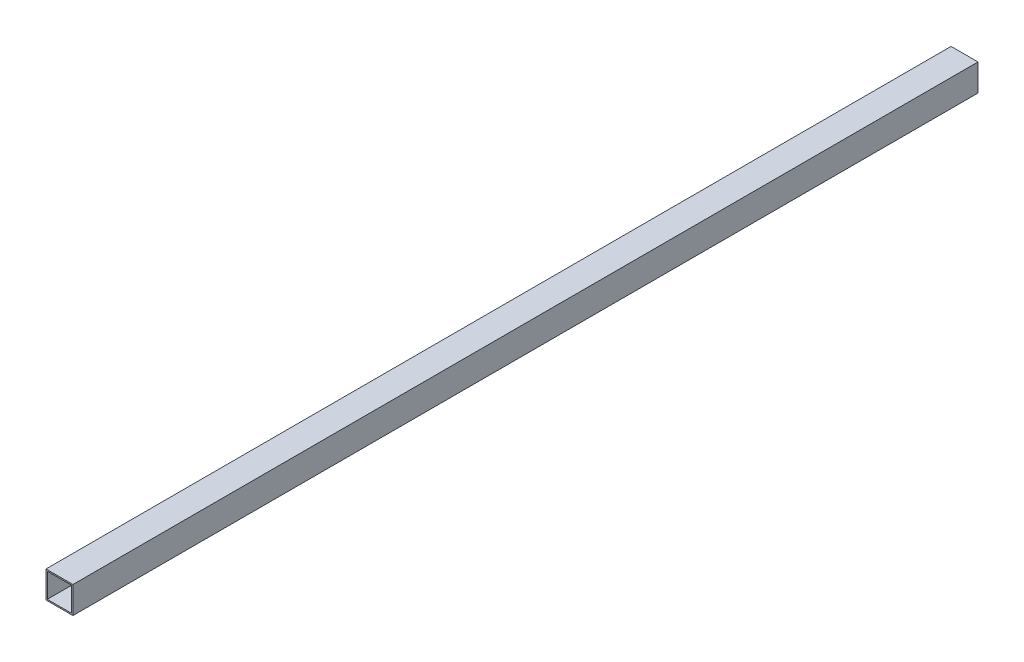
ISO-10303-21;
HEADER;
FILE_DESCRIPTION(('STEP AP214'),'2;1');
FILE_NAME('part.step','',(''),(''),'','','');
FILE_SCHEMA(('AUTOMOTIVE_DESIGN { 1 0 10303 214 1 1 1 1 }'));
ENDSEC;
DATA;
#1=APPLICATION_CONTEXT('core data for automotive mechanical design processes');
#2=APPLICATION_PROTOCOL_DEFINITION('international standard','automotive_design',2000,#1);
#3=PRODUCT_CONTEXT('',#1,'mechanical');
#4=PRODUCT('Part','Part','',(#3));
#5=PRODUCT_RELATED_PRODUCT_CATEGORY('part','',(#4));
#6=PRODUCT_DEFINITION_FORMATION('','',#4);
#7=PRODUCT_DEFINITION_CONTEXT('part definition',#1,'design');
#8=PRODUCT_DEFINITION('design','',#6,#7);
#9=PRODUCT_DEFINITION_SHAPE('','',#8);
#10=(LENGTH_UNIT() NAMED_UNIT(*) SI_UNIT(.MILLI.,.METRE.));
#11=(NAMED_UNIT(*) PLANE_ANGLE_UNIT() SI_UNIT($,.RADIAN.));
#12=(NAMED_UNIT(*) SI_UNIT($,.STERADIAN.) SOLID_ANGLE_UNIT());
#13=UNCERTAINTY_MEASURE_WITH_UNIT(LENGTH_MEASURE(1.E-05),#10,'distance_accuracy_value','');
#14=(GEOMETRIC_REPRESENTATION_CONTEXT(3) GLOBAL_UNCERTAINTY_ASSIGNED_CONTEXT((#13)) GLOBAL_UNIT_ASSIGNED_CONTEXT((#10,
#11,#12)) REPRESENTATION_CONTEXT('',''));
#15=CARTESIAN_POINT('',(0.,0.,0.));
#16=DIRECTION('',(0.,0.,1.));
#17=DIRECTION('',(1.,0.,0.));
#18=AXIS2_PLACEMENT_3D('',#15,#16,#17);
#19=CARTESIAN_POINT('',(0.,0.,840.));
#20=DIRECTION('',(0.,0.,1.));
#21=DIRECTION('',(1.,0.,0.));
#22=AXIS2_PLACEMENT_3D('',#19,#20,#21);
#23=PLANE('',#22);
#24=DIRECTION('',(0.,-1.,0.));
#25=VECTOR('',#24,1.);
#26=CARTESIAN_POINT('',(-12.5,-12.5,840.));
#27=LINE('',#26,#25);
#28=CARTESIAN_POINT('',(-12.5,12.5,840.));
#29=VERTEX_POINT('',#28);
#30=CARTESIAN_POINT('',(-12.5,-12.5,840.));
#31=VERTEX_POINT('',#30);
#32=EDGE_CURVE('E134',#29,#31,#27,.T.);
#33=ORIENTED_EDGE('',*,*,#32,.T.);
#34=DIRECTION('',(1.,0.,0.));
#35=VECTOR('',#34,1.);
#36=CARTESIAN_POINT('',(12.5,-12.5,840.));
#37=LINE('',#36,#35);
#38=CARTESIAN_POINT('',(12.5,-12.5,840.));
#39=VERTEX_POINT('',#38);
#40=EDGE_CURVE('E137',#31,#39,#37,.T.);
#41=ORIENTED_EDGE('',*,*,#40,.T.);
#42=DIRECTION('',(0.,1.,0.));
#43=VECTOR('',#42,1.);
#44=CARTESIAN_POINT('',(12.5,-12.5,840.));
#45=LINE('',#44,#43);
#46=CARTESIAN_POINT('',(12.5,12.5,840.));
#47=VERTEX_POINT('',#46);
#48=EDGE_CURVE('E140',#39,#47,#45,.T.);
#49=ORIENTED_EDGE('',*,*,#48,.T.);
#50=DIRECTION('',(-1.,0.,0.));
#51=VECTOR('',#50,1.);
#52=CARTESIAN_POINT('',(12.5,12.5,840.));
#53=LINE('',#52,#51);
#54=EDGE_CURVE('E142',#47,#29,#53,.T.);
#55=ORIENTED_EDGE('',*,*,#54,.T.);
#56=EDGE_LOOP('',(#33,#41,#49,#55));
#57=FACE_BOUND('',#56,.T.);
#58=DIRECTION('',(-1.,0.,0.));
#59=VECTOR('',#58,1.);
#60=CARTESIAN_POINT('',(11.3,11.3,840.));
#61=LINE('',#60,#59);
#62=CARTESIAN_POINT('',(11.3,11.3,840.));
#63=VERTEX_POINT('',#62);
#64=CARTESIAN_POINT('',(-11.3,11.3,840.));
#65=VERTEX_POINT('',#64);
#66=EDGE_CURVE('E106',#63,#65,#61,.T.);
#67=ORIENTED_EDGE('',*,*,#66,.F.);
#68=DIRECTION('',(0.,1.,0.));
#69=VECTOR('',#68,1.);
#70=CARTESIAN_POINT('',(11.3,-11.3,840.));
#71=LINE('',#70,#69);
#72=CARTESIAN_POINT('',(11.3,-11.3,840.));
#73=VERTEX_POINT('',#72);
#74=EDGE_CURVE('E98',#73,#63,#71,.T.);
#75=ORIENTED_EDGE('',*,*,#74,.F.);
#76=DIRECTION('',(1.,0.,0.));
#77=VECTOR('',#76,1.);
#78=CARTESIAN_POINT('',(11.3,-11.3,840.));
#79=LINE('',#78,#77);
#80=CARTESIAN_POINT('',(-11.3,-11.3,840.));
#81=VERTEX_POINT('',#80);
#82=EDGE_CURVE('E120',#81,#73,#79,.T.);
#83=ORIENTED_EDGE('',*,*,#82,.F.);
#84=DIRECTION('',(0.,-1.,0.));
#85=VECTOR('',#84,1.);
#86=CARTESIAN_POINT('',(-11.3,-11.3,840.));
#87=LINE('',#86,#85);
#88=EDGE_CURVE('E118',#65,#81,#87,.T.);
#89=ORIENTED_EDGE('',*,*,#88,.F.);
#90=EDGE_LOOP('',(#67,#75,#83,#89));
#91=FACE_BOUND('',#90,.T.);
#92=ADVANCED_FACE('F33',(#57,#91),#23,.T.);
#93=CARTESIAN_POINT('',(0.,0.,0.));
#94=DIRECTION('',(0.,0.,1.));
#95=DIRECTION('',(1.,0.,0.));
#96=AXIS2_PLACEMENT_3D('',#93,#94,#95);
#97=PLANE('',#96);
#98=DIRECTION('',(0.,-1.,0.));
#99=VECTOR('',#98,1.);
#100=CARTESIAN_POINT('',(-12.5,-12.5,0.));
#101=LINE('',#100,#99);
#102=CARTESIAN_POINT('',(-12.5,12.5,0.));
#103=VERTEX_POINT('',#102);
#104=CARTESIAN_POINT('',(-12.5,-12.5,0.));
#105=VERTEX_POINT('',#104);
#106=EDGE_CURVE('E114',#103,#105,#101,.T.);
#107=ORIENTED_EDGE('',*,*,#106,.F.);
#108=DIRECTION('',(-1.,0.,0.));
#109=VECTOR('',#108,1.);
#110=CARTESIAN_POINT('',(12.5,12.5,0.));
#111=LINE('',#110,#109);
#112=CARTESIAN_POINT('',(12.5,12.5,0.));
#113=VERTEX_POINT('',#112);
#114=EDGE_CURVE('E138',#113,#103,#111,.T.);
#115=ORIENTED_EDGE('',*,*,#114,.F.);
#116=DIRECTION('',(0.,1.,0.));
#117=VECTOR('',#116,1.);
#118=CARTESIAN_POINT('',(12.5,-12.5,0.));
#119=LINE('',#118,#117);
#120=CARTESIAN_POINT('',(12.5,-12.5,0.));
#121=VERTEX_POINT('',#120);
#122=EDGE_CURVE('E149',#121,#113,#119,.T.);
#123=ORIENTED_EDGE('',*,*,#122,.F.);
#124=DIRECTION('',(1.,0.,0.));
#125=VECTOR('',#124,1.);
#126=CARTESIAN_POINT('',(12.5,-12.5,0.));
#127=LINE('',#126,#125);
#128=EDGE_CURVE('E147',#105,#121,#127,.T.);
#129=ORIENTED_EDGE('',*,*,#128,.F.);
#130=EDGE_LOOP('',(#107,#115,#123,#129));
#131=FACE_BOUND('',#130,.T.);
#132=DIRECTION('',(0.,1.,0.));
#133=VECTOR('',#132,1.);
#134=CARTESIAN_POINT('',(11.3,-11.3,0.));
#135=LINE('',#134,#133);
#136=CARTESIAN_POINT('',(11.3,-11.3,0.));
#137=VERTEX_POINT('',#136);
#138=CARTESIAN_POINT('',(11.3,11.3,0.));
#139=VERTEX_POINT('',#138);
#140=EDGE_CURVE('E56',#137,#139,#135,.T.);
#141=ORIENTED_EDGE('',*,*,#140,.T.);
#142=DIRECTION('',(-1.,0.,0.));
#143=VECTOR('',#142,1.);
#144=CARTESIAN_POINT('',(11.3,11.3,0.));
#145=LINE('',#144,#143);
#146=CARTESIAN_POINT('',(-11.3,11.3,0.));
#147=VERTEX_POINT('',#146);
#148=EDGE_CURVE('E113',#139,#147,#145,.T.);
#149=ORIENTED_EDGE('',*,*,#148,.T.);
#150=DIRECTION('',(0.,-1.,0.));
#151=VECTOR('',#150,1.);
#152=CARTESIAN_POINT('',(-11.3,-11.3,0.));
#153=LINE('',#152,#151);
#154=CARTESIAN_POINT('',(-11.3,-11.3,0.));
#155=VERTEX_POINT('',#154);
#156=EDGE_CURVE('E126',#147,#155,#153,.T.);
#157=ORIENTED_EDGE('',*,*,#156,.T.);
#158=DIRECTION('',(1.,0.,0.));
#159=VECTOR('',#158,1.);
#160=CARTESIAN_POINT('',(11.3,-11.3,0.));
#161=LINE('',#160,#159);
#162=EDGE_CURVE('E107',#155,#137,#161,.T.);
#163=ORIENTED_EDGE('',*,*,#162,.T.);
#164=EDGE_LOOP('',(#141,#149,#157,#163));
#165=FACE_BOUND('',#164,.T.);
#166=ADVANCED_FACE('F167',(#131,#165),#97,.F.);
#167=CARTESIAN_POINT('',(-12.5,-12.5,840.));
#168=DIRECTION('',(1.,0.,0.));
#169=DIRECTION('',(0.,0.,-1.));
#170=AXIS2_PLACEMENT_3D('',#167,#168,#169);
#171=PLANE('',#170);
#172=ORIENTED_EDGE('',*,*,#106,.T.);
#173=DIRECTION('',(0.,0.,-1.));
#174=VECTOR('',#173,1.);
#175=CARTESIAN_POINT('',(-12.5,-12.5,840.));
#176=LINE('',#175,#174);
#177=EDGE_CURVE('E11',#31,#105,#176,.T.);
#178=ORIENTED_EDGE('',*,*,#177,.F.);
#179=ORIENTED_EDGE('',*,*,#32,.F.);
#180=DIRECTION('',(0.,0.,-1.));
#181=VECTOR('',#180,1.);
#182=CARTESIAN_POINT('',(-12.5,12.5,840.));
#183=LINE('',#182,#181);
#184=EDGE_CURVE('E144',#29,#103,#183,.T.);
#185=ORIENTED_EDGE('',*,*,#184,.T.);
#186=EDGE_LOOP('',(#172,#178,#179,#185));
#187=FACE_BOUND('',#186,.T.);
#188=ADVANCED_FACE('F35',(#187),#171,.F.);
#189=CARTESIAN_POINT('',(12.5,-12.5,840.));
#190=DIRECTION('',(0.,1.,0.));
#191=DIRECTION('',(-1.,0.,0.));
#192=AXIS2_PLACEMENT_3D('',#189,#190,#191);
#193=PLANE('',#192);
#194=ORIENTED_EDGE('',*,*,#128,.T.);
#195=DIRECTION('',(0.,0.,-1.));
#196=VECTOR('',#195,1.);
#197=CARTESIAN_POINT('',(12.5,-12.5,840.));
#198=LINE('',#197,#196);
#199=EDGE_CURVE('E41',#39,#121,#198,.T.);
#200=ORIENTED_EDGE('',*,*,#199,.F.);
#201=ORIENTED_EDGE('',*,*,#40,.F.);
#202=ORIENTED_EDGE('',*,*,#177,.T.);
#203=EDGE_LOOP('',(#194,#200,#201,#202));
#204=FACE_BOUND('',#203,.T.);
#205=ADVANCED_FACE('F177',(#204),#193,.F.);
#206=CARTESIAN_POINT('',(12.5,-12.5,840.));
#207=DIRECTION('',(-1.,0.,0.));
#208=DIRECTION('',(0.,0.,1.));
#209=AXIS2_PLACEMENT_3D('',#206,#207,#208);
#210=PLANE('',#209);
#211=ORIENTED_EDGE('',*,*,#122,.T.);
#212=DIRECTION('',(0.,0.,-1.));
#213=VECTOR('',#212,1.);
#214=CARTESIAN_POINT('',(12.5,12.5,840.));
#215=LINE('',#214,#213);
#216=EDGE_CURVE('E154',#47,#113,#215,.T.);
#217=ORIENTED_EDGE('',*,*,#216,.F.);
#218=ORIENTED_EDGE('',*,*,#48,.F.);
#219=ORIENTED_EDGE('',*,*,#199,.T.);
#220=EDGE_LOOP('',(#211,#217,#218,#219));
#221=FACE_BOUND('',#220,.T.);
#222=ADVANCED_FACE('F161',(#221),#210,.F.);
#223=CARTESIAN_POINT('',(12.5,12.5,840.));
#224=DIRECTION('',(0.,-1.,0.));
#225=DIRECTION('',(1.,0.,0.));
#226=AXIS2_PLACEMENT_3D('',#223,#224,#225);
#227=PLANE('',#226);
#228=ORIENTED_EDGE('',*,*,#114,.T.);
#229=ORIENTED_EDGE('',*,*,#184,.F.);
#230=ORIENTED_EDGE('',*,*,#54,.F.);
#231=ORIENTED_EDGE('',*,*,#216,.T.);
#232=EDGE_LOOP('',(#228,#229,#230,#231));
#233=FACE_BOUND('',#232,.T.);
#234=ADVANCED_FACE('F171',(#233),#227,.F.);
#235=CARTESIAN_POINT('',(11.3,-11.3,840.));
#236=DIRECTION('',(-1.,0.,0.));
#237=DIRECTION('',(0.,0.,1.));
#238=AXIS2_PLACEMENT_3D('',#235,#236,#237);
#239=PLANE('',#238);
#240=ORIENTED_EDGE('',*,*,#140,.F.);
#241=DIRECTION('',(0.,0.,-1.));
#242=VECTOR('',#241,1.);
#243=CARTESIAN_POINT('',(11.3,-11.3,840.));
#244=LINE('',#243,#242);
#245=EDGE_CURVE('E102',#73,#137,#244,.T.);
#246=ORIENTED_EDGE('',*,*,#245,.F.);
#247=ORIENTED_EDGE('',*,*,#74,.T.);
#248=DIRECTION('',(0.,0.,-1.));
#249=VECTOR('',#248,1.);
#250=CARTESIAN_POINT('',(11.3,11.3,840.));
#251=LINE('',#250,#249);
#252=EDGE_CURVE('E101',#63,#139,#251,.T.);
#253=ORIENTED_EDGE('',*,*,#252,.T.);
#254=EDGE_LOOP('',(#240,#246,#247,#253));
#255=FACE_BOUND('',#254,.T.);
#256=ADVANCED_FACE('F100',(#255),#239,.T.);
#257=CARTESIAN_POINT('',(11.3,11.3,840.));
#258=DIRECTION('',(0.,-1.,0.));
#259=DIRECTION('',(1.,0.,0.));
#260=AXIS2_PLACEMENT_3D('',#257,#258,#259);
#261=PLANE('',#260);
#262=ORIENTED_EDGE('',*,*,#148,.F.);
#263=ORIENTED_EDGE('',*,*,#252,.F.);
#264=ORIENTED_EDGE('',*,*,#66,.T.);
#265=DIRECTION('',(0.,0.,-1.));
#266=VECTOR('',#265,1.);
#267=CARTESIAN_POINT('',(-11.3,11.3,840.));
#268=LINE('',#267,#266);
#269=EDGE_CURVE('E115',#65,#147,#268,.T.);
#270=ORIENTED_EDGE('',*,*,#269,.T.);
#271=EDGE_LOOP('',(#262,#263,#264,#270));
#272=FACE_BOUND('',#271,.T.);
#273=ADVANCED_FACE('F110',(#272),#261,.T.);
#274=CARTESIAN_POINT('',(-11.3,-11.3,840.));
#275=DIRECTION('',(1.,0.,0.));
#276=DIRECTION('',(0.,0.,-1.));
#277=AXIS2_PLACEMENT_3D('',#274,#275,#276);
#278=PLANE('',#277);
#279=ORIENTED_EDGE('',*,*,#156,.F.);
#280=ORIENTED_EDGE('',*,*,#269,.F.);
#281=ORIENTED_EDGE('',*,*,#88,.T.);
#282=DIRECTION('',(0.,0.,-1.));
#283=VECTOR('',#282,1.);
#284=CARTESIAN_POINT('',(-11.3,-11.3,840.));
#285=LINE('',#284,#283);
#286=EDGE_CURVE('E48',#81,#155,#285,.T.);
#287=ORIENTED_EDGE('',*,*,#286,.T.);
#288=EDGE_LOOP('',(#279,#280,#281,#287));
#289=FACE_BOUND('',#288,.T.);
#290=ADVANCED_FACE('F200',(#289),#278,.T.);
#291=CARTESIAN_POINT('',(11.3,-11.3,840.));
#292=DIRECTION('',(0.,1.,0.));
#293=DIRECTION('',(-1.,0.,0.));
#294=AXIS2_PLACEMENT_3D('',#291,#292,#293);
#295=PLANE('',#294);
#296=ORIENTED_EDGE('',*,*,#162,.F.);
#297=ORIENTED_EDGE('',*,*,#286,.F.);
#298=ORIENTED_EDGE('',*,*,#82,.T.);
#299=ORIENTED_EDGE('',*,*,#245,.T.);
#300=EDGE_LOOP('',(#296,#297,#298,#299));
#301=FACE_BOUND('',#300,.T.);
#302=ADVANCED_FACE('F204',(#301),#295,.T.);
#303=CLOSED_SHELL('',(#92,#166,#188,#205,#222,#234,#256,#273,#290,#302));
#304=MANIFOLD_SOLID_BREP('B2',#303);
#305=ADVANCED_BREP_SHAPE_REPRESENTATION('',(#18,#304),#14);
#306=SHAPE_DEFINITION_REPRESENTATION(#9,#305);
ENDSEC;
END-ISO-10303-21;
